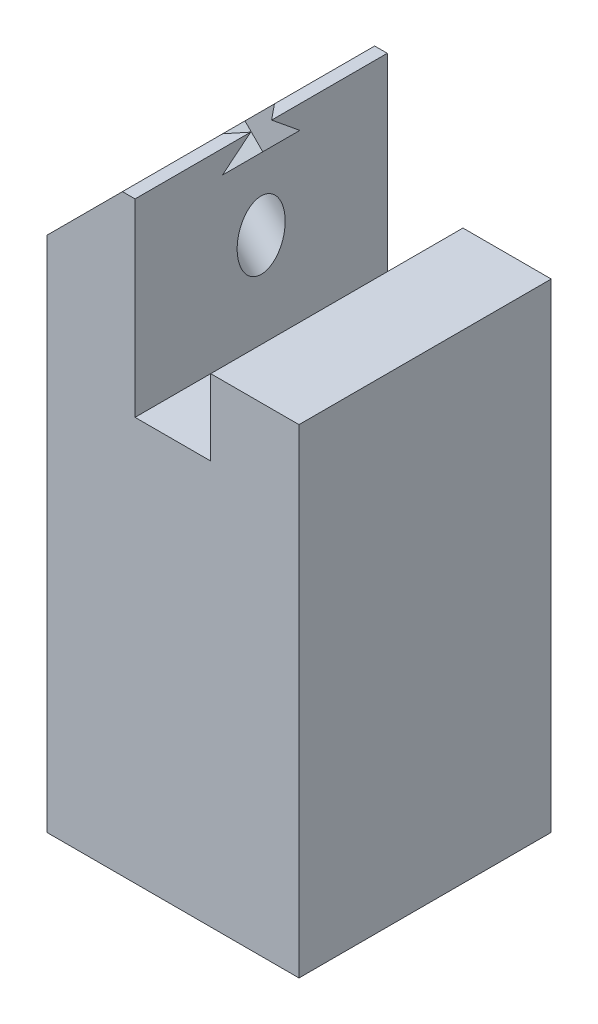
ISO-10303-21;
HEADER;
FILE_DESCRIPTION(('STEP AP214'),'2;1');
FILE_NAME('part.step','',(''),(''),'','','');
FILE_SCHEMA(('AUTOMOTIVE_DESIGN { 1 0 10303 214 1 1 1 1 }'));
ENDSEC;
DATA;
#1=APPLICATION_CONTEXT('core data for automotive mechanical design processes');
#2=APPLICATION_PROTOCOL_DEFINITION('international standard','automotive_design',2000,#1);
#3=PRODUCT_CONTEXT('',#1,'mechanical');
#4=PRODUCT('Part','Part','',(#3));
#5=PRODUCT_RELATED_PRODUCT_CATEGORY('part','',(#4));
#6=PRODUCT_DEFINITION_FORMATION('','',#4);
#7=PRODUCT_DEFINITION_CONTEXT('part definition',#1,'design');
#8=PRODUCT_DEFINITION('design','',#6,#7);
#9=PRODUCT_DEFINITION_SHAPE('','',#8);
#10=(LENGTH_UNIT() NAMED_UNIT(*) SI_UNIT(.MILLI.,.METRE.));
#11=(NAMED_UNIT(*) PLANE_ANGLE_UNIT() SI_UNIT($,.RADIAN.));
#12=(NAMED_UNIT(*) SI_UNIT($,.STERADIAN.) SOLID_ANGLE_UNIT());
#13=UNCERTAINTY_MEASURE_WITH_UNIT(LENGTH_MEASURE(1.E-05),#10,'distance_accuracy_value','');
#14=(GEOMETRIC_REPRESENTATION_CONTEXT(3) GLOBAL_UNCERTAINTY_ASSIGNED_CONTEXT((#13)) GLOBAL_UNIT_ASSIGNED_CONTEXT((#10,
#11,#12)) REPRESENTATION_CONTEXT('',''));
#15=CARTESIAN_POINT('',(0.,0.,0.));
#16=DIRECTION('',(0.,0.,1.));
#17=DIRECTION('',(1.,0.,0.));
#18=AXIS2_PLACEMENT_3D('',#15,#16,#17);
#19=CARTESIAN_POINT('',(0.,21.,0.));
#20=DIRECTION('',(0.,-1.,0.));
#21=DIRECTION('',(0.,0.,-1.));
#22=AXIS2_PLACEMENT_3D('',#19,#20,#21);
#23=PLANE('',#22);
#24=DIRECTION('',(0.,0.,-1.));
#25=VECTOR('',#24,1.);
#26=CARTESIAN_POINT('',(-3.,21.,10.));
#27=LINE('',#26,#25);
#28=CARTESIAN_POINT('',(-3.,21.,10.));
#29=VERTEX_POINT('',#28);
#30=CARTESIAN_POINT('',(-3.,21.,0.828081094438323));
#31=VERTEX_POINT('',#30);
#32=EDGE_CURVE('E338',#29,#31,#27,.T.);
#33=ORIENTED_EDGE('',*,*,#32,.T.);
#34=DIRECTION('',(-0.632455532033677,0.,0.774596669241482));
#35=VECTOR('',#34,1.);
#36=CARTESIAN_POINT('',(-1.39432477059613,21.,-1.13846140789458));
#37=LINE('',#36,#35);
#38=CARTESIAN_POINT('',(-4.00000000000001,21.,2.05282596582991));
#39=VERTEX_POINT('',#38);
#40=EDGE_CURVE('E313',#31,#39,#37,.T.);
#41=ORIENTED_EDGE('',*,*,#40,.T.);
#42=DIRECTION('',(0.,0.,1.));
#43=VECTOR('',#42,1.);
#44=CARTESIAN_POINT('',(-4.00000000000001,21.,0.));
#45=LINE('',#44,#43);
#46=CARTESIAN_POINT('',(-4.00000000000001,21.,10.));
#47=VERTEX_POINT('',#46);
#48=EDGE_CURVE('E384',#39,#47,#45,.T.);
#49=ORIENTED_EDGE('',*,*,#48,.T.);
#50=DIRECTION('',(1.,0.,0.));
#51=VECTOR('',#50,1.);
#52=CARTESIAN_POINT('',(-10.,21.,10.));
#53=LINE('',#52,#51);
#54=EDGE_CURVE('E335',#47,#29,#53,.T.);
#55=ORIENTED_EDGE('',*,*,#54,.T.);
#56=EDGE_LOOP('',(#33,#41,#49,#55));
#57=FACE_BOUND('',#56,.T.);
#58=ADVANCED_FACE('F36',(#57),#23,.F.);
#59=CARTESIAN_POINT('',(-4.00000000000001,21.,0.));
#60=DIRECTION('',(0.707106781186549,-0.707106781186546,0.));
#61=DIRECTION('',(0.,0.,1.));
#62=AXIS2_PLACEMENT_3D('',#59,#60,#61);
#63=PLANE('',#62);
#64=DIRECTION('',(0.353553390593273,0.353553390593275,-0.866025403784438));
#65=VECTOR('',#64,1.);
#66=CARTESIAN_POINT('',(-5.20317876114943,19.7968212388506,5.));
#67=LINE('',#66,#65);
#68=CARTESIAN_POINT('',(-5.20317876114943,19.7968212388506,5.));
#69=VERTEX_POINT('',#68);
#70=EDGE_CURVE('E256',#69,#39,#67,.T.);
#71=ORIENTED_EDGE('',*,*,#70,.F.);
#72=DIRECTION('',(0.707106781186546,0.707106781186549,0.));
#73=VECTOR('',#72,1.);
#74=CARTESIAN_POINT('',(-9.28566166578806,15.7143383342119,5.));
#75=LINE('',#74,#73);
#76=CARTESIAN_POINT('',(-9.28566166578806,15.7143383342119,5.));
#77=VERTEX_POINT('',#76);
#78=EDGE_CURVE('E261',#77,#69,#75,.T.);
#79=ORIENTED_EDGE('',*,*,#78,.F.);
#80=DIRECTION('',(0.353553390593273,0.353553390593274,0.866025403784439));
#81=VECTOR('',#80,1.);
#82=CARTESIAN_POINT('',(-11.3269031181074,13.6730968818926,0.));
#83=LINE('',#82,#81);
#84=CARTESIAN_POINT('',(-10.,15.,3.25023557747101));
#85=VERTEX_POINT('',#84);
#86=EDGE_CURVE('E284',#85,#77,#83,.T.);
#87=ORIENTED_EDGE('',*,*,#86,.F.);
#88=DIRECTION('',(0.,0.,-1.));
#89=VECTOR('',#88,1.);
#90=CARTESIAN_POINT('',(-10.,15.,10.));
#91=LINE('',#90,#89);
#92=CARTESIAN_POINT('',(-10.,15.,10.));
#93=VERTEX_POINT('',#92);
#94=EDGE_CURVE('E45',#93,#85,#91,.T.);
#95=ORIENTED_EDGE('',*,*,#94,.F.);
#96=DIRECTION('',(0.707106781186546,0.707106781186549,0.));
#97=VECTOR('',#96,1.);
#98=CARTESIAN_POINT('',(-4.00000000000001,21.,10.));
#99=LINE('',#98,#97);
#100=EDGE_CURVE('E388',#47,#93,#99,.F.);
#101=ORIENTED_EDGE('',*,*,#100,.F.);
#102=ORIENTED_EDGE('',*,*,#48,.F.);
#103=EDGE_LOOP('',(#71,#79,#87,#95,#101,#102));
#104=FACE_BOUND('',#103,.T.);
#105=ADVANCED_FACE('F401',(#104),#63,.F.);
#106=CARTESIAN_POINT('',(-0.173352401603255,10.6845119746658,0.));
#107=DIRECTION('',(-0.707106781186549,0.707106781186546,0.));
#108=DIRECTION('',(-0.707106781186546,-0.707106781186549,0.));
#109=AXIS2_PLACEMENT_3D('',#106,#107,#108);
#110=CYLINDRICAL_SURFACE('',#109,1.905);
#111=CARTESIAN_POINT('',(-3.,13.5111595730625,0.));
#112=DIRECTION('',(-1.,0.,0.));
#113=DIRECTION('',(0.,1.,0.));
#114=AXIS2_PLACEMENT_3D('',#111,#112,#113);
#115=ELLIPSE('',#114,2.69407683632074,1.905);
#116=CARTESIAN_POINT('',(-3.,16.2052364093833,0.));
#117=VERTEX_POINT('',#116);
#118=EDGE_CURVE('E331',#117,#117,#115,.T.);
#119=ORIENTED_EDGE('',*,*,#118,.F.);
#120=EDGE_LOOP('',(#119));
#121=FACE_BOUND('',#120,.T.);
#122=CARTESIAN_POINT('',(-5.83020665109565,16.3413662241582,0.));
#123=DIRECTION('',(-0.707106781186549,0.707106781186546,0.));
#124=DIRECTION('',(-0.707106781186546,-0.707106781186549,0.));
#125=AXIS2_PLACEMENT_3D('',#122,#123,#124);
#126=CIRCLE('',#125,1.905);
#127=CARTESIAN_POINT('',(-7.17724506925602,14.9943278059978,0.));
#128=VERTEX_POINT('',#127);
#129=EDGE_CURVE('E290',#128,#128,#126,.F.);
#130=ORIENTED_EDGE('',*,*,#129,.F.);
#131=EDGE_LOOP('',(#130));
#132=FACE_BOUND('',#131,.T.);
#133=ADVANCED_FACE('F398',(#121,#132),#110,.F.);
#134=CARTESIAN_POINT('',(0.,6.,0.));
#135=DIRECTION('',(0.,-1.,0.));
#136=DIRECTION('',(0.,0.,-1.));
#137=AXIS2_PLACEMENT_3D('',#134,#135,#136);
#138=PLANE('',#137);
#139=DIRECTION('',(0.,0.,-1.));
#140=VECTOR('',#139,1.);
#141=CARTESIAN_POINT('',(-3.,6.,10.));
#142=LINE('',#141,#140);
#143=CARTESIAN_POINT('',(-3.,6.,10.));
#144=VERTEX_POINT('',#143);
#145=CARTESIAN_POINT('',(-3.,6.,-10.));
#146=VERTEX_POINT('',#145);
#147=EDGE_CURVE('E334',#144,#146,#142,.T.);
#148=ORIENTED_EDGE('',*,*,#147,.F.);
#149=DIRECTION('',(1.,0.,0.));
#150=VECTOR('',#149,1.);
#151=CARTESIAN_POINT('',(-10.,6.,10.));
#152=LINE('',#151,#150);
#153=CARTESIAN_POINT('',(3.,6.,10.));
#154=VERTEX_POINT('',#153);
#155=EDGE_CURVE('E374',#144,#154,#152,.T.);
#156=ORIENTED_EDGE('',*,*,#155,.T.);
#157=DIRECTION('',(0.,0.,1.));
#158=VECTOR('',#157,1.);
#159=CARTESIAN_POINT('',(3.,6.,10.));
#160=LINE('',#159,#158);
#161=CARTESIAN_POINT('',(3.,6.,-10.));
#162=VERTEX_POINT('',#161);
#163=EDGE_CURVE('E352',#162,#154,#160,.T.);
#164=ORIENTED_EDGE('',*,*,#163,.F.);
#165=DIRECTION('',(-1.,0.,0.));
#166=VECTOR('',#165,1.);
#167=CARTESIAN_POINT('',(-10.,6.,-10.));
#168=LINE('',#167,#166);
#169=EDGE_CURVE('E372',#162,#146,#168,.T.);
#170=ORIENTED_EDGE('',*,*,#169,.T.);
#171=EDGE_LOOP('',(#148,#156,#164,#170));
#172=FACE_BOUND('',#171,.T.);
#173=ADVANCED_FACE('F400',(#172),#138,.F.);
#174=CARTESIAN_POINT('',(10.,6.,10.));
#175=DIRECTION('',(-1.,0.,0.));
#176=DIRECTION('',(0.,0.,1.));
#177=AXIS2_PLACEMENT_3D('',#174,#175,#176);
#178=PLANE('',#177);
#179=DIRECTION('',(0.,-1.,0.));
#180=VECTOR('',#179,1.);
#181=CARTESIAN_POINT('',(10.,6.,10.));
#182=LINE('',#181,#180);
#183=CARTESIAN_POINT('',(10.,12.,10.));
#184=VERTEX_POINT('',#183);
#185=CARTESIAN_POINT('',(10.,-26.,10.));
#186=VERTEX_POINT('',#185);
#187=EDGE_CURVE('E376',#184,#186,#182,.T.);
#188=ORIENTED_EDGE('',*,*,#187,.T.);
#189=DIRECTION('',(0.,0.,1.));
#190=VECTOR('',#189,1.);
#191=CARTESIAN_POINT('',(10.,-26.,-10.));
#192=LINE('',#191,#190);
#193=CARTESIAN_POINT('',(10.,-26.,-10.));
#194=VERTEX_POINT('',#193);
#195=EDGE_CURVE('E325',#194,#186,#192,.T.);
#196=ORIENTED_EDGE('',*,*,#195,.F.);
#197=DIRECTION('',(0.,-1.,0.));
#198=VECTOR('',#197,1.);
#199=CARTESIAN_POINT('',(10.,6.,-10.));
#200=LINE('',#199,#198);
#201=CARTESIAN_POINT('',(10.,12.,-10.));
#202=VERTEX_POINT('',#201);
#203=EDGE_CURVE('E382',#202,#194,#200,.T.);
#204=ORIENTED_EDGE('',*,*,#203,.F.);
#205=DIRECTION('',(0.,0.,-1.));
#206=VECTOR('',#205,1.);
#207=CARTESIAN_POINT('',(10.,12.,10.));
#208=LINE('',#207,#206);
#209=EDGE_CURVE('E359',#184,#202,#208,.T.);
#210=ORIENTED_EDGE('',*,*,#209,.F.);
#211=EDGE_LOOP('',(#188,#196,#204,#210));
#212=FACE_BOUND('',#211,.T.);
#213=ADVANCED_FACE('F408',(#212),#178,.F.);
#214=CARTESIAN_POINT('',(-10.,6.,-10.));
#215=DIRECTION('',(0.,0.,1.));
#216=DIRECTION('',(1.,0.,0.));
#217=AXIS2_PLACEMENT_3D('',#214,#215,#216);
#218=PLANE('',#217);
#219=DIRECTION('',(0.,-1.,0.));
#220=VECTOR('',#219,1.);
#221=CARTESIAN_POINT('',(-10.,6.,-10.));
#222=LINE('',#221,#220);
#223=CARTESIAN_POINT('',(-10.,15.,-10.));
#224=VERTEX_POINT('',#223);
#225=CARTESIAN_POINT('',(-10.,-26.,-10.));
#226=VERTEX_POINT('',#225);
#227=EDGE_CURVE('E380',#224,#226,#222,.T.);
#228=ORIENTED_EDGE('',*,*,#227,.F.);
#229=DIRECTION('',(-0.707106781186546,-0.707106781186549,0.));
#230=VECTOR('',#229,1.);
#231=CARTESIAN_POINT('',(-4.00000000000001,21.,-10.));
#232=LINE('',#231,#230);
#233=CARTESIAN_POINT('',(-4.00000000000001,21.,-10.));
#234=VERTEX_POINT('',#233);
#235=EDGE_CURVE('E11',#224,#234,#232,.F.);
#236=ORIENTED_EDGE('',*,*,#235,.T.);
#237=DIRECTION('',(-1.,0.,0.));
#238=VECTOR('',#237,1.);
#239=CARTESIAN_POINT('',(-10.,21.,-10.));
#240=LINE('',#239,#238);
#241=CARTESIAN_POINT('',(-3.,21.,-10.));
#242=VERTEX_POINT('',#241);
#243=EDGE_CURVE('E341',#242,#234,#240,.T.);
#244=ORIENTED_EDGE('',*,*,#243,.F.);
#245=DIRECTION('',(0.,-1.,0.));
#246=VECTOR('',#245,1.);
#247=CARTESIAN_POINT('',(-3.,21.,-10.));
#248=LINE('',#247,#246);
#249=EDGE_CURVE('E344',#242,#146,#248,.T.);
#250=ORIENTED_EDGE('',*,*,#249,.T.);
#251=ORIENTED_EDGE('',*,*,#169,.F.);
#252=DIRECTION('',(0.,-1.,0.));
#253=VECTOR('',#252,1.);
#254=CARTESIAN_POINT('',(3.,12.,-10.));
#255=LINE('',#254,#253);
#256=CARTESIAN_POINT('',(3.,12.,-10.));
#257=VERTEX_POINT('',#256);
#258=EDGE_CURVE('E364',#257,#162,#255,.T.);
#259=ORIENTED_EDGE('',*,*,#258,.F.);
#260=DIRECTION('',(-1.,0.,0.));
#261=VECTOR('',#260,1.);
#262=CARTESIAN_POINT('',(3.,12.,-10.));
#263=LINE('',#262,#261);
#264=EDGE_CURVE('E362',#202,#257,#263,.T.);
#265=ORIENTED_EDGE('',*,*,#264,.F.);
#266=ORIENTED_EDGE('',*,*,#203,.T.);
#267=DIRECTION('',(1.,0.,0.));
#268=VECTOR('',#267,1.);
#269=CARTESIAN_POINT('',(10.,-26.,-10.));
#270=LINE('',#269,#268);
#271=EDGE_CURVE('E322',#226,#194,#270,.T.);
#272=ORIENTED_EDGE('',*,*,#271,.F.);
#273=EDGE_LOOP('',(#228,#236,#244,#250,#251,#259,#265,#266,#272));
#274=FACE_BOUND('',#273,.T.);
#275=ADVANCED_FACE('F453',(#274),#218,.F.);
#276=CARTESIAN_POINT('',(-10.,6.,10.));
#277=DIRECTION('',(1.,0.,0.));
#278=DIRECTION('',(0.,0.,-1.));
#279=AXIS2_PLACEMENT_3D('',#276,#277,#278);
#280=PLANE('',#279);
#281=ORIENTED_EDGE('',*,*,#94,.T.);
#282=DIRECTION('',(0.,-0.632455532033675,-0.774596669241484));
#283=VECTOR('',#282,1.);
#284=CARTESIAN_POINT('',(-10.,14.7066957438375,2.8910126939787));
#285=LINE('',#284,#283);
#286=CARTESIAN_POINT('',(-10.,12.3461937637853,0.));
#287=VERTEX_POINT('',#286);
#288=EDGE_CURVE('E310',#85,#287,#285,.T.);
#289=ORIENTED_EDGE('',*,*,#288,.T.);
#290=DIRECTION('',(0.,0.632455532033675,-0.774596669241484));
#291=VECTOR('',#290,1.);
#292=CARTESIAN_POINT('',(-10.,4.9087367727048,9.10898730602131));
#293=LINE('',#292,#291);
#294=CARTESIAN_POINT('',(-10.,15.,-3.25023557747101));
#295=VERTEX_POINT('',#294);
#296=EDGE_CURVE('E307',#287,#295,#293,.T.);
#297=ORIENTED_EDGE('',*,*,#296,.T.);
#298=EDGE_CURVE('E390',#295,#224,#91,.T.);
#299=ORIENTED_EDGE('',*,*,#298,.T.);
#300=ORIENTED_EDGE('',*,*,#227,.T.);
#301=DIRECTION('',(0.,0.,-1.));
#302=VECTOR('',#301,1.);
#303=CARTESIAN_POINT('',(-10.,-26.,-10.));
#304=LINE('',#303,#302);
#305=CARTESIAN_POINT('',(-10.,-26.,10.));
#306=VERTEX_POINT('',#305);
#307=EDGE_CURVE('E319',#306,#226,#304,.T.);
#308=ORIENTED_EDGE('',*,*,#307,.F.);
#309=DIRECTION('',(0.,-1.,0.));
#310=VECTOR('',#309,1.);
#311=CARTESIAN_POINT('',(-10.,6.,10.));
#312=LINE('',#311,#310);
#313=EDGE_CURVE('E378',#93,#306,#312,.T.);
#314=ORIENTED_EDGE('',*,*,#313,.F.);
#315=EDGE_LOOP('',(#281,#289,#297,#299,#300,#308,#314));
#316=FACE_BOUND('',#315,.T.);
#317=ADVANCED_FACE('F457',(#316),#280,.F.);
#318=CARTESIAN_POINT('',(-10.,6.,10.));
#319=DIRECTION('',(0.,0.,-1.));
#320=DIRECTION('',(-1.,0.,0.));
#321=AXIS2_PLACEMENT_3D('',#318,#319,#320);
#322=PLANE('',#321);
#323=ORIENTED_EDGE('',*,*,#54,.F.);
#324=ORIENTED_EDGE('',*,*,#100,.T.);
#325=ORIENTED_EDGE('',*,*,#313,.T.);
#326=DIRECTION('',(-1.,0.,0.));
#327=VECTOR('',#326,1.);
#328=CARTESIAN_POINT('',(10.,-26.,10.));
#329=LINE('',#328,#327);
#330=EDGE_CURVE('E328',#186,#306,#329,.T.);
#331=ORIENTED_EDGE('',*,*,#330,.F.);
#332=ORIENTED_EDGE('',*,*,#187,.F.);
#333=DIRECTION('',(1.,0.,0.));
#334=VECTOR('',#333,1.);
#335=CARTESIAN_POINT('',(3.,12.,10.));
#336=LINE('',#335,#334);
#337=CARTESIAN_POINT('',(3.,12.,10.));
#338=VERTEX_POINT('',#337);
#339=EDGE_CURVE('E356',#338,#184,#336,.T.);
#340=ORIENTED_EDGE('',*,*,#339,.F.);
#341=DIRECTION('',(0.,-1.,0.));
#342=VECTOR('',#341,1.);
#343=CARTESIAN_POINT('',(3.,12.,10.));
#344=LINE('',#343,#342);
#345=EDGE_CURVE('E369',#338,#154,#344,.T.);
#346=ORIENTED_EDGE('',*,*,#345,.T.);
#347=ORIENTED_EDGE('',*,*,#155,.F.);
#348=DIRECTION('',(0.,-1.,0.));
#349=VECTOR('',#348,1.);
#350=CARTESIAN_POINT('',(-3.,21.,10.));
#351=LINE('',#350,#349);
#352=EDGE_CURVE('E349',#29,#144,#351,.T.);
#353=ORIENTED_EDGE('',*,*,#352,.F.);
#354=EDGE_LOOP('',(#323,#324,#325,#331,#332,#340,#346,#347,#353));
#355=FACE_BOUND('',#354,.T.);
#356=ADVANCED_FACE('F478',(#355),#322,.F.);
#357=CARTESIAN_POINT('',(3.,12.,10.));
#358=DIRECTION('',(1.,0.,0.));
#359=DIRECTION('',(0.,0.,-1.));
#360=AXIS2_PLACEMENT_3D('',#357,#358,#359);
#361=PLANE('',#360);
#362=ORIENTED_EDGE('',*,*,#163,.T.);
#363=ORIENTED_EDGE('',*,*,#345,.F.);
#364=DIRECTION('',(0.,0.,1.));
#365=VECTOR('',#364,1.);
#366=CARTESIAN_POINT('',(3.,12.,10.));
#367=LINE('',#366,#365);
#368=EDGE_CURVE('E353',#257,#338,#367,.T.);
#369=ORIENTED_EDGE('',*,*,#368,.F.);
#370=ORIENTED_EDGE('',*,*,#258,.T.);
#371=EDGE_LOOP('',(#362,#363,#369,#370));
#372=FACE_BOUND('',#371,.T.);
#373=ADVANCED_FACE('F484',(#372),#361,.F.);
#374=CARTESIAN_POINT('',(0.,12.,0.));
#375=DIRECTION('',(0.,-1.,0.));
#376=DIRECTION('',(0.,0.,-1.));
#377=AXIS2_PLACEMENT_3D('',#374,#375,#376);
#378=PLANE('',#377);
#379=ORIENTED_EDGE('',*,*,#368,.T.);
#380=ORIENTED_EDGE('',*,*,#339,.T.);
#381=ORIENTED_EDGE('',*,*,#209,.T.);
#382=ORIENTED_EDGE('',*,*,#264,.T.);
#383=EDGE_LOOP('',(#379,#380,#381,#382));
#384=FACE_BOUND('',#383,.T.);
#385=ADVANCED_FACE('F430',(#384),#378,.F.);
#386=CARTESIAN_POINT('',(-3.,21.,10.));
#387=DIRECTION('',(-1.,0.,0.));
#388=DIRECTION('',(0.,0.,1.));
#389=AXIS2_PLACEMENT_3D('',#386,#387,#388);
#390=PLANE('',#389);
#391=ORIENTED_EDGE('',*,*,#118,.T.);
#392=EDGE_LOOP('',(#391));
#393=FACE_BOUND('',#392,.T.);
#394=DIRECTION('',(0.,0.,-1.));
#395=VECTOR('',#394,1.);
#396=CARTESIAN_POINT('',(-3.,19.1715728752538,10.));
#397=LINE('',#396,#395);
#398=CARTESIAN_POINT('',(-3.,19.1715728752538,3.06743783818447));
#399=VERTEX_POINT('',#398);
#400=CARTESIAN_POINT('',(-3.,19.1715728752538,-3.06743783818447));
#401=VERTEX_POINT('',#400);
#402=EDGE_CURVE('E301',#399,#401,#397,.T.);
#403=ORIENTED_EDGE('',*,*,#402,.F.);
#404=DIRECTION('',(0.,0.632455532033676,-0.774596669241484));
#405=VECTOR('',#404,1.);
#406=CARTESIAN_POINT('',(-3.,16.5066957438375,6.33123243777533));
#407=LINE('',#406,#405);
#408=EDGE_CURVE('E316',#399,#31,#407,.T.);
#409=ORIENTED_EDGE('',*,*,#408,.T.);
#410=ORIENTED_EDGE('',*,*,#32,.F.);
#411=ORIENTED_EDGE('',*,*,#352,.T.);
#412=ORIENTED_EDGE('',*,*,#147,.T.);
#413=ORIENTED_EDGE('',*,*,#249,.F.);
#414=CARTESIAN_POINT('',(-3.,21.,-0.828081094438326));
#415=VERTEX_POINT('',#414);
#416=EDGE_CURVE('E337',#415,#242,#27,.T.);
#417=ORIENTED_EDGE('',*,*,#416,.F.);
#418=DIRECTION('',(0.,-0.632455532033676,-0.774596669241484));
#419=VECTOR('',#418,1.);
#420=CARTESIAN_POINT('',(-3.,26.3046547149702,5.66876756222467));
#421=LINE('',#420,#419);
#422=EDGE_CURVE('E304',#415,#401,#421,.T.);
#423=ORIENTED_EDGE('',*,*,#422,.T.);
#424=EDGE_LOOP('',(#403,#409,#410,#411,#412,#413,#417,#423));
#425=FACE_BOUND('',#424,.T.);
#426=ADVANCED_FACE('F422',(#393,#425),#390,.F.);
#427=CARTESIAN_POINT('',(-4.00000000000001,21.,-2.05282596582992));
#428=VERTEX_POINT('',#427);
#429=EDGE_CURVE('E385',#234,#428,#45,.T.);
#430=ORIENTED_EDGE('',*,*,#429,.T.);
#431=DIRECTION('',(0.632455532033677,0.,0.774596669241482));
#432=VECTOR('',#431,1.);
#433=CARTESIAN_POINT('',(-1.39432477059613,21.,1.13846140789458));
#434=LINE('',#433,#432);
#435=EDGE_CURVE('E61',#428,#415,#434,.T.);
#436=ORIENTED_EDGE('',*,*,#435,.T.);
#437=ORIENTED_EDGE('',*,*,#416,.T.);
#438=ORIENTED_EDGE('',*,*,#243,.T.);
#439=EDGE_LOOP('',(#430,#436,#437,#438));
#440=FACE_BOUND('',#439,.T.);
#441=ADVANCED_FACE('F417',(#440),#23,.F.);
#442=DIRECTION('',(-0.353553390593273,-0.353553390593275,0.866025403784439));
#443=VECTOR('',#442,1.);
#444=CARTESIAN_POINT('',(-9.28566166578806,15.7143383342119,-5.));
#445=LINE('',#444,#443);
#446=CARTESIAN_POINT('',(-9.28566166578806,15.7143383342119,-5.));
#447=VERTEX_POINT('',#446);
#448=EDGE_CURVE('E282',#447,#295,#445,.T.);
#449=ORIENTED_EDGE('',*,*,#448,.F.);
#450=DIRECTION('',(-0.707106781186546,-0.707106781186549,0.));
#451=VECTOR('',#450,1.);
#452=CARTESIAN_POINT('',(-5.20317876114943,19.7968212388506,-5.));
#453=LINE('',#452,#451);
#454=CARTESIAN_POINT('',(-5.20317876114943,19.7968212388506,-5.));
#455=VERTEX_POINT('',#454);
#456=EDGE_CURVE('E279',#455,#447,#453,.T.);
#457=ORIENTED_EDGE('',*,*,#456,.F.);
#458=DIRECTION('',(-0.353553390593273,-0.353553390593275,-0.866025403784438));
#459=VECTOR('',#458,1.);
#460=CARTESIAN_POINT('',(-3.16193730883012,21.8380626911699,0.));
#461=LINE('',#460,#459);
#462=EDGE_CURVE('E277',#428,#455,#461,.T.);
#463=ORIENTED_EDGE('',*,*,#462,.F.);
#464=ORIENTED_EDGE('',*,*,#429,.F.);
#465=ORIENTED_EDGE('',*,*,#235,.F.);
#466=ORIENTED_EDGE('',*,*,#298,.F.);
#467=EDGE_LOOP('',(#449,#457,#463,#464,#465,#466));
#468=FACE_BOUND('',#467,.T.);
#469=ADVANCED_FACE('F38',(#468),#63,.F.);
#470=CARTESIAN_POINT('',(0.,-26.,0.));
#471=DIRECTION('',(0.,-1.,0.));
#472=DIRECTION('',(0.,0.,-1.));
#473=AXIS2_PLACEMENT_3D('',#470,#471,#472);
#474=PLANE('',#473);
#475=DIRECTION('',(-0.867964050699415,0.,-0.496627029765259));
#476=VECTOR('',#475,1.);
#477=CARTESIAN_POINT('',(0.0247073670413129,-26.,6.35080490011677));
#478=LINE('',#477,#476);
#479=CARTESIAN_POINT('',(0.0247073670413129,-26.,6.35080490011677));
#480=VERTEX_POINT('',#479);
#481=CARTESIAN_POINT('',(-5.48760469445916,-26.,3.19679965757679));
#482=VERTEX_POINT('',#481);
#483=EDGE_CURVE('E53',#480,#482,#478,.T.);
#484=ORIENTED_EDGE('',*,*,#483,.F.);
#485=DIRECTION('',(-0.864073649332432,0.,0.503365402594708));
#486=VECTOR('',#485,1.);
#487=CARTESIAN_POINT('',(5.51231206150047,-26.,3.15400524253998));
#488=LINE('',#487,#486);
#489=CARTESIAN_POINT('',(5.51231206150047,-26.,3.15400524253998));
#490=VERTEX_POINT('',#489);
#491=EDGE_CURVE('E220',#490,#480,#488,.T.);
#492=ORIENTED_EDGE('',*,*,#491,.F.);
#493=DIRECTION('',(0.00389040136698241,0.,0.999992432359967));
#494=VECTOR('',#493,1.);
#495=CARTESIAN_POINT('',(5.48760469445916,-26.,-3.19679965757679));
#496=LINE('',#495,#494);
#497=CARTESIAN_POINT('',(5.48760469445916,-26.,-3.19679965757679));
#498=VERTEX_POINT('',#497);
#499=EDGE_CURVE('E223',#498,#490,#496,.T.);
#500=ORIENTED_EDGE('',*,*,#499,.F.);
#501=DIRECTION('',(0.867964050699415,0.,0.496627029765259));
#502=VECTOR('',#501,1.);
#503=CARTESIAN_POINT('',(-0.0247073670413127,-26.,-6.35080490011677));
#504=LINE('',#503,#502);
#505=CARTESIAN_POINT('',(-0.0247073670413127,-26.,-6.35080490011677));
#506=VERTEX_POINT('',#505);
#507=EDGE_CURVE('E239',#506,#498,#504,.T.);
#508=ORIENTED_EDGE('',*,*,#507,.F.);
#509=DIRECTION('',(0.864073649332432,0.,-0.503365402594708));
#510=VECTOR('',#509,1.);
#511=CARTESIAN_POINT('',(-5.51231206150048,-26.,-3.15400524253998));
#512=LINE('',#511,#510);
#513=CARTESIAN_POINT('',(-5.51231206150048,-26.,-3.15400524253998));
#514=VERTEX_POINT('',#513);
#515=EDGE_CURVE('E236',#514,#506,#512,.T.);
#516=ORIENTED_EDGE('',*,*,#515,.F.);
#517=DIRECTION('',(-0.00389040136698241,0.,-0.999992432359967));
#518=VECTOR('',#517,1.);
#519=CARTESIAN_POINT('',(-5.48760469445916,-26.,3.19679965757679));
#520=LINE('',#519,#518);
#521=EDGE_CURVE('E234',#482,#514,#520,.T.);
#522=ORIENTED_EDGE('',*,*,#521,.F.);
#523=EDGE_LOOP('',(#484,#492,#500,#508,#516,#522));
#524=FACE_BOUND('',#523,.T.);
#525=ORIENTED_EDGE('',*,*,#307,.T.);
#526=ORIENTED_EDGE('',*,*,#271,.T.);
#527=ORIENTED_EDGE('',*,*,#195,.T.);
#528=ORIENTED_EDGE('',*,*,#330,.T.);
#529=EDGE_LOOP('',(#525,#526,#527,#528));
#530=FACE_BOUND('',#529,.T.);
#531=ADVANCED_FACE('F428',(#524,#530),#474,.T.);
#532=CARTESIAN_POINT('',(-3.78896519877634,18.3826076764775,5.));
#533=DIRECTION('',(0.612372435695793,0.612372435695796,0.5));
#534=DIRECTION('',(-0.707106781186549,0.707106781186546,0.));
#535=AXIS2_PLACEMENT_3D('',#532,#533,#534);
#536=PLANE('',#535);
#537=DIRECTION('',(0.353553390593273,0.353553390593275,-0.866025403784438));
#538=VECTOR('',#537,1.);
#539=CARTESIAN_POINT('',(-3.78896519877634,18.3826076764775,5.));
#540=LINE('',#539,#538);
#541=CARTESIAN_POINT('',(-3.78896519877634,18.3826076764775,5.));
#542=VERTEX_POINT('',#541);
#543=EDGE_CURVE('E257',#542,#399,#540,.T.);
#544=ORIENTED_EDGE('',*,*,#543,.F.);
#545=DIRECTION('',(-0.707106781186549,0.707106781186546,0.));
#546=VECTOR('',#545,1.);
#547=CARTESIAN_POINT('',(-3.78896519877634,18.3826076764775,5.));
#548=LINE('',#547,#546);
#549=EDGE_CURVE('E288',#542,#69,#548,.T.);
#550=ORIENTED_EDGE('',*,*,#549,.T.);
#551=ORIENTED_EDGE('',*,*,#70,.T.);
#552=ORIENTED_EDGE('',*,*,#40,.F.);
#553=ORIENTED_EDGE('',*,*,#408,.F.);
#554=EDGE_LOOP('',(#544,#550,#551,#552,#553));
#555=FACE_BOUND('',#554,.T.);
#556=ADVANCED_FACE('F471',(#555),#536,.F.);
#557=CARTESIAN_POINT('',(-9.91268955573427,12.2588833195195,0.));
#558=DIRECTION('',(-0.612372435695793,-0.612372435695796,0.5));
#559=DIRECTION('',(0.707106781186549,-0.707106781186546,0.));
#560=AXIS2_PLACEMENT_3D('',#557,#558,#559);
#561=PLANE('',#560);
#562=ORIENTED_EDGE('',*,*,#86,.T.);
#563=DIRECTION('',(-0.707106781186549,0.707106781186546,0.));
#564=VECTOR('',#563,1.);
#565=CARTESIAN_POINT('',(-7.87144810341496,14.3001247718388,5.));
#566=LINE('',#565,#564);
#567=CARTESIAN_POINT('',(-7.87144810341496,14.3001247718388,5.));
#568=VERTEX_POINT('',#567);
#569=EDGE_CURVE('E291',#568,#77,#566,.T.);
#570=ORIENTED_EDGE('',*,*,#569,.F.);
#571=DIRECTION('',(0.353553390593273,0.353553390593274,0.866025403784439));
#572=VECTOR('',#571,1.);
#573=CARTESIAN_POINT('',(-9.91268955573427,12.2588833195195,0.));
#574=LINE('',#573,#572);
#575=CARTESIAN_POINT('',(-9.91268955573427,12.2588833195195,0.));
#576=VERTEX_POINT('',#575);
#577=EDGE_CURVE('E269',#576,#568,#574,.T.);
#578=ORIENTED_EDGE('',*,*,#577,.F.);
#579=DIRECTION('',(-0.707106781186549,0.707106781186546,0.));
#580=VECTOR('',#579,1.);
#581=CARTESIAN_POINT('',(-9.91268955573427,12.2588833195195,0.));
#582=LINE('',#581,#580);
#583=EDGE_CURVE('E294',#576,#287,#582,.T.);
#584=ORIENTED_EDGE('',*,*,#583,.T.);
#585=ORIENTED_EDGE('',*,*,#288,.F.);
#586=EDGE_LOOP('',(#562,#570,#578,#584,#585));
#587=FACE_BOUND('',#586,.T.);
#588=ADVANCED_FACE('F463',(#587),#561,.F.);
#589=CARTESIAN_POINT('',(-7.87144810341496,14.3001247718388,-5.));
#590=DIRECTION('',(-0.612372435695793,-0.612372435695796,-0.5));
#591=DIRECTION('',(0.707106781186549,-0.707106781186546,0.));
#592=AXIS2_PLACEMENT_3D('',#589,#590,#591);
#593=PLANE('',#592);
#594=ORIENTED_EDGE('',*,*,#583,.F.);
#595=DIRECTION('',(-0.353553390593273,-0.353553390593275,0.866025403784439));
#596=VECTOR('',#595,1.);
#597=CARTESIAN_POINT('',(-7.87144810341496,14.3001247718388,-5.));
#598=LINE('',#597,#596);
#599=CARTESIAN_POINT('',(-7.87144810341496,14.3001247718388,-5.));
#600=VERTEX_POINT('',#599);
#601=EDGE_CURVE('E266',#600,#576,#598,.T.);
#602=ORIENTED_EDGE('',*,*,#601,.F.);
#603=DIRECTION('',(-0.707106781186549,0.707106781186546,0.));
#604=VECTOR('',#603,1.);
#605=CARTESIAN_POINT('',(-7.87144810341496,14.3001247718388,-5.));
#606=LINE('',#605,#604);
#607=EDGE_CURVE('E297',#600,#447,#606,.T.);
#608=ORIENTED_EDGE('',*,*,#607,.T.);
#609=ORIENTED_EDGE('',*,*,#448,.T.);
#610=ORIENTED_EDGE('',*,*,#296,.F.);
#611=EDGE_LOOP('',(#594,#602,#608,#609,#610));
#612=FACE_BOUND('',#611,.T.);
#613=ADVANCED_FACE('F460',(#612),#593,.F.);
#614=CARTESIAN_POINT('',(-1.74772374645702,20.4238491287968,0.));
#615=DIRECTION('',(0.612372435695793,0.612372435695796,-0.500000000000001));
#616=DIRECTION('',(-0.707106781186549,0.707106781186546,0.));
#617=AXIS2_PLACEMENT_3D('',#614,#615,#616);
#618=PLANE('',#617);
#619=ORIENTED_EDGE('',*,*,#435,.F.);
#620=ORIENTED_EDGE('',*,*,#462,.T.);
#621=DIRECTION('',(-0.707106781186549,0.707106781186546,0.));
#622=VECTOR('',#621,1.);
#623=CARTESIAN_POINT('',(-3.78896519877634,18.3826076764775,-5.));
#624=LINE('',#623,#622);
#625=CARTESIAN_POINT('',(-3.78896519877634,18.3826076764775,-5.));
#626=VERTEX_POINT('',#625);
#627=EDGE_CURVE('E275',#626,#455,#624,.T.);
#628=ORIENTED_EDGE('',*,*,#627,.F.);
#629=DIRECTION('',(-0.353553390593273,-0.353553390593275,-0.866025403784438));
#630=VECTOR('',#629,1.);
#631=CARTESIAN_POINT('',(-1.74772374645702,20.4238491287968,0.));
#632=LINE('',#631,#630);
#633=EDGE_CURVE('E260',#401,#626,#632,.T.);
#634=ORIENTED_EDGE('',*,*,#633,.F.);
#635=ORIENTED_EDGE('',*,*,#422,.F.);
#636=EDGE_LOOP('',(#619,#620,#628,#634,#635));
#637=FACE_BOUND('',#636,.T.);
#638=ADVANCED_FACE('F440',(#637),#618,.F.);
#639=CARTESIAN_POINT('',(-11.0857864376269,11.0857864376269,0.));
#640=DIRECTION('',(-0.707106781186549,0.707106781186546,0.));
#641=DIRECTION('',(-0.707106781186546,-0.707106781186549,0.));
#642=AXIS2_PLACEMENT_3D('',#639,#640,#641);
#643=PLANE('',#642);
#644=ORIENTED_EDGE('',*,*,#129,.T.);
#645=EDGE_LOOP('',(#644));
#646=FACE_BOUND('',#645,.T.);
#647=ORIENTED_EDGE('',*,*,#402,.T.);
#648=ORIENTED_EDGE('',*,*,#633,.T.);
#649=DIRECTION('',(-0.707106781186546,-0.707106781186549,0.));
#650=VECTOR('',#649,1.);
#651=CARTESIAN_POINT('',(-3.78896519877634,18.3826076764775,-5.));
#652=LINE('',#651,#650);
#653=EDGE_CURVE('E263',#626,#600,#652,.T.);
#654=ORIENTED_EDGE('',*,*,#653,.T.);
#655=ORIENTED_EDGE('',*,*,#601,.T.);
#656=ORIENTED_EDGE('',*,*,#577,.T.);
#657=DIRECTION('',(0.707106781186546,0.707106781186549,0.));
#658=VECTOR('',#657,1.);
#659=CARTESIAN_POINT('',(-7.87144810341496,14.3001247718388,5.));
#660=LINE('',#659,#658);
#661=EDGE_CURVE('E272',#568,#542,#660,.T.);
#662=ORIENTED_EDGE('',*,*,#661,.T.);
#663=ORIENTED_EDGE('',*,*,#543,.T.);
#664=EDGE_LOOP('',(#647,#648,#654,#655,#656,#662,#663));
#665=FACE_BOUND('',#664,.T.);
#666=ADVANCED_FACE('F395',(#646,#665),#643,.T.);
#667=CARTESIAN_POINT('',(-7.87144810341496,14.3001247718388,5.));
#668=DIRECTION('',(0.,0.,1.));
#669=DIRECTION('',(1.,0.,0.));
#670=AXIS2_PLACEMENT_3D('',#667,#668,#669);
#671=PLANE('',#670);
#672=ORIENTED_EDGE('',*,*,#78,.T.);
#673=ORIENTED_EDGE('',*,*,#549,.F.);
#674=ORIENTED_EDGE('',*,*,#661,.F.);
#675=ORIENTED_EDGE('',*,*,#569,.T.);
#676=EDGE_LOOP('',(#672,#673,#674,#675));
#677=FACE_BOUND('',#676,.T.);
#678=ADVANCED_FACE('F466',(#677),#671,.F.);
#679=CARTESIAN_POINT('',(-3.78896519877634,18.3826076764775,-5.));
#680=DIRECTION('',(0.,0.,-1.));
#681=DIRECTION('',(0.,1.,0.));
#682=AXIS2_PLACEMENT_3D('',#679,#680,#681);
#683=PLANE('',#682);
#684=ORIENTED_EDGE('',*,*,#456,.T.);
#685=ORIENTED_EDGE('',*,*,#607,.F.);
#686=ORIENTED_EDGE('',*,*,#653,.F.);
#687=ORIENTED_EDGE('',*,*,#627,.T.);
#688=EDGE_LOOP('',(#684,#685,#686,#687));
#689=FACE_BOUND('',#688,.T.);
#690=ADVANCED_FACE('F444',(#689),#683,.F.);
#691=CARTESIAN_POINT('',(0.,-20.,0.));
#692=DIRECTION('',(0.,-1.,0.));
#693=DIRECTION('',(0.,0.,-1.));
#694=AXIS2_PLACEMENT_3D('',#691,#692,#693);
#695=PLANE('',#694);
#696=DIRECTION('',(-0.867964050699415,0.,-0.496627029765259));
#697=VECTOR('',#696,1.);
#698=CARTESIAN_POINT('',(0.0247073670413129,-20.,6.35080490011677));
#699=LINE('',#698,#697);
#700=CARTESIAN_POINT('',(0.0247073670413129,-20.,6.35080490011677));
#701=VERTEX_POINT('',#700);
#702=CARTESIAN_POINT('',(-5.48760469445916,-20.,3.19679965757679));
#703=VERTEX_POINT('',#702);
#704=EDGE_CURVE('E200',#701,#703,#699,.T.);
#705=ORIENTED_EDGE('',*,*,#704,.T.);
#706=DIRECTION('',(-0.00389040136698241,0.,-0.999992432359967));
#707=VECTOR('',#706,1.);
#708=CARTESIAN_POINT('',(-5.48760469445916,-20.,3.19679965757679));
#709=LINE('',#708,#707);
#710=CARTESIAN_POINT('',(-5.51231206150048,-20.,-3.15400524253998));
#711=VERTEX_POINT('',#710);
#712=EDGE_CURVE('E209',#703,#711,#709,.T.);
#713=ORIENTED_EDGE('',*,*,#712,.T.);
#714=DIRECTION('',(0.864073649332432,0.,-0.503365402594708));
#715=VECTOR('',#714,1.);
#716=CARTESIAN_POINT('',(-5.51231206150048,-20.,-3.15400524253998));
#717=LINE('',#716,#715);
#718=CARTESIAN_POINT('',(-0.0247073670413127,-20.,-6.35080490011677));
#719=VERTEX_POINT('',#718);
#720=EDGE_CURVE('E214',#711,#719,#717,.T.);
#721=ORIENTED_EDGE('',*,*,#720,.T.);
#722=DIRECTION('',(0.867964050699415,0.,0.496627029765259));
#723=VECTOR('',#722,1.);
#724=CARTESIAN_POINT('',(-0.0247073670413127,-20.,-6.35080490011677));
#725=LINE('',#724,#723);
#726=CARTESIAN_POINT('',(5.48760469445916,-20.,-3.19679965757679));
#727=VERTEX_POINT('',#726);
#728=EDGE_CURVE('E227',#719,#727,#725,.T.);
#729=ORIENTED_EDGE('',*,*,#728,.T.);
#730=DIRECTION('',(0.00389040136698241,0.,0.999992432359967));
#731=VECTOR('',#730,1.);
#732=CARTESIAN_POINT('',(5.48760469445916,-20.,-3.19679965757679));
#733=LINE('',#732,#731);
#734=CARTESIAN_POINT('',(5.51231206150047,-20.,3.15400524253998));
#735=VERTEX_POINT('',#734);
#736=EDGE_CURVE('E230',#727,#735,#733,.T.);
#737=ORIENTED_EDGE('',*,*,#736,.T.);
#738=DIRECTION('',(-0.864073649332432,0.,0.503365402594708));
#739=VECTOR('',#738,1.);
#740=CARTESIAN_POINT('',(5.51231206150047,-20.,3.15400524253998));
#741=LINE('',#740,#739);
#742=EDGE_CURVE('E206',#735,#701,#741,.T.);
#743=ORIENTED_EDGE('',*,*,#742,.T.);
#744=EDGE_LOOP('',(#705,#713,#721,#729,#737,#743));
#745=FACE_BOUND('',#744,.T.);
#746=CARTESIAN_POINT('',(0.,-20.,0.));
#747=DIRECTION('',(0.,-1.,0.));
#748=DIRECTION('',(0.,0.,-1.));
#749=AXIS2_PLACEMENT_3D('',#746,#747,#748);
#750=CIRCLE('',#749,2.75);
#751=CARTESIAN_POINT('',(0.,-20.,-2.75));
#752=VERTEX_POINT('',#751);
#753=EDGE_CURVE('E40',#752,#752,#750,.F.);
#754=ORIENTED_EDGE('',*,*,#753,.T.);
#755=EDGE_LOOP('',(#754));
#756=FACE_BOUND('',#755,.T.);
#757=ADVANCED_FACE('F216',(#745,#756),#695,.T.);
#758=CARTESIAN_POINT('',(0.0247073670413129,-20.,6.35080490011677));
#759=DIRECTION('',(-0.496627029765259,0.,0.867964050699415));
#760=DIRECTION('',(0.867964050699415,0.,0.496627029765259));
#761=AXIS2_PLACEMENT_3D('',#758,#759,#760);
#762=PLANE('',#761);
#763=ORIENTED_EDGE('',*,*,#483,.T.);
#764=DIRECTION('',(0.,-1.,0.));
#765=VECTOR('',#764,1.);
#766=CARTESIAN_POINT('',(-5.48760469445916,-20.,3.19679965757679));
#767=LINE('',#766,#765);
#768=EDGE_CURVE('E196',#703,#482,#767,.T.);
#769=ORIENTED_EDGE('',*,*,#768,.F.);
#770=ORIENTED_EDGE('',*,*,#704,.F.);
#771=DIRECTION('',(0.,-1.,0.));
#772=VECTOR('',#771,1.);
#773=CARTESIAN_POINT('',(0.0247073670413129,-20.,6.35080490011677));
#774=LINE('',#773,#772);
#775=EDGE_CURVE('E244',#701,#480,#774,.T.);
#776=ORIENTED_EDGE('',*,*,#775,.T.);
#777=EDGE_LOOP('',(#763,#769,#770,#776));
#778=FACE_BOUND('',#777,.T.);
#779=ADVANCED_FACE('F198',(#778),#762,.F.);
#780=CARTESIAN_POINT('',(5.51231206150047,-20.,3.15400524253998));
#781=DIRECTION('',(0.503365402594708,0.,0.864073649332432));
#782=DIRECTION('',(0.864073649332433,0.,-0.503365402594708));
#783=AXIS2_PLACEMENT_3D('',#780,#781,#782);
#784=PLANE('',#783);
#785=ORIENTED_EDGE('',*,*,#491,.T.);
#786=ORIENTED_EDGE('',*,*,#775,.F.);
#787=ORIENTED_EDGE('',*,*,#742,.F.);
#788=DIRECTION('',(0.,-1.,0.));
#789=VECTOR('',#788,1.);
#790=CARTESIAN_POINT('',(5.51231206150047,-20.,3.15400524253998));
#791=LINE('',#790,#789);
#792=EDGE_CURVE('E246',#735,#490,#791,.T.);
#793=ORIENTED_EDGE('',*,*,#792,.T.);
#794=EDGE_LOOP('',(#785,#786,#787,#793));
#795=FACE_BOUND('',#794,.T.);
#796=ADVANCED_FACE('F628',(#795),#784,.F.);
#797=CARTESIAN_POINT('',(5.48760469445916,-20.,-3.19679965757679));
#798=DIRECTION('',(0.999992432359967,0.,-0.00389040136698241));
#799=DIRECTION('',(-0.00389040136698241,0.,-0.999992432359967));
#800=AXIS2_PLACEMENT_3D('',#797,#798,#799);
#801=PLANE('',#800);
#802=ORIENTED_EDGE('',*,*,#499,.T.);
#803=ORIENTED_EDGE('',*,*,#792,.F.);
#804=ORIENTED_EDGE('',*,*,#736,.F.);
#805=DIRECTION('',(0.,-1.,0.));
#806=VECTOR('',#805,1.);
#807=CARTESIAN_POINT('',(5.48760469445916,-20.,-3.19679965757679));
#808=LINE('',#807,#806);
#809=EDGE_CURVE('E248',#727,#498,#808,.T.);
#810=ORIENTED_EDGE('',*,*,#809,.T.);
#811=EDGE_LOOP('',(#802,#803,#804,#810));
#812=FACE_BOUND('',#811,.T.);
#813=ADVANCED_FACE('F637',(#812),#801,.F.);
#814=CARTESIAN_POINT('',(-0.0247073670413127,-20.,-6.35080490011677));
#815=DIRECTION('',(0.496627029765259,0.,-0.867964050699415));
#816=DIRECTION('',(-0.867964050699415,0.,-0.496627029765259));
#817=AXIS2_PLACEMENT_3D('',#814,#815,#816);
#818=PLANE('',#817);
#819=ORIENTED_EDGE('',*,*,#507,.T.);
#820=ORIENTED_EDGE('',*,*,#809,.F.);
#821=ORIENTED_EDGE('',*,*,#728,.F.);
#822=DIRECTION('',(0.,-1.,0.));
#823=VECTOR('',#822,1.);
#824=CARTESIAN_POINT('',(-0.0247073670413127,-20.,-6.35080490011677));
#825=LINE('',#824,#823);
#826=EDGE_CURVE('E250',#719,#506,#825,.T.);
#827=ORIENTED_EDGE('',*,*,#826,.T.);
#828=EDGE_LOOP('',(#819,#820,#821,#827));
#829=FACE_BOUND('',#828,.T.);
#830=ADVANCED_FACE('F647',(#829),#818,.F.);
#831=CARTESIAN_POINT('',(-5.51231206150048,-20.,-3.15400524253998));
#832=DIRECTION('',(-0.503365402594708,0.,-0.864073649332432));
#833=DIRECTION('',(-0.864073649332432,0.,0.503365402594708));
#834=AXIS2_PLACEMENT_3D('',#831,#832,#833);
#835=PLANE('',#834);
#836=ORIENTED_EDGE('',*,*,#515,.T.);
#837=ORIENTED_EDGE('',*,*,#826,.F.);
#838=ORIENTED_EDGE('',*,*,#720,.F.);
#839=DIRECTION('',(0.,-1.,0.));
#840=VECTOR('',#839,1.);
#841=CARTESIAN_POINT('',(-5.51231206150048,-20.,-3.15400524253998));
#842=LINE('',#841,#840);
#843=EDGE_CURVE('E205',#711,#514,#842,.T.);
#844=ORIENTED_EDGE('',*,*,#843,.T.);
#845=EDGE_LOOP('',(#836,#837,#838,#844));
#846=FACE_BOUND('',#845,.T.);
#847=ADVANCED_FACE('F657',(#846),#835,.F.);
#848=CARTESIAN_POINT('',(-5.48760469445916,-20.,3.19679965757679));
#849=DIRECTION('',(-0.999992432359967,0.,0.00389040136698241));
#850=DIRECTION('',(0.00389040136698241,0.,0.999992432359967));
#851=AXIS2_PLACEMENT_3D('',#848,#849,#850);
#852=PLANE('',#851);
#853=ORIENTED_EDGE('',*,*,#521,.T.);
#854=ORIENTED_EDGE('',*,*,#843,.F.);
#855=ORIENTED_EDGE('',*,*,#712,.F.);
#856=ORIENTED_EDGE('',*,*,#768,.T.);
#857=EDGE_LOOP('',(#853,#854,#855,#856));
#858=FACE_BOUND('',#857,.T.);
#859=ADVANCED_FACE('F210',(#858),#852,.F.);
#860=CARTESIAN_POINT('',(0.,-6.,0.));
#861=DIRECTION('',(0.,-1.,0.));
#862=DIRECTION('',(0.,0.,-1.));
#863=AXIS2_PLACEMENT_3D('',#860,#861,#862);
#864=PLANE('',#863);
#865=CARTESIAN_POINT('',(0.,-6.,0.));
#866=DIRECTION('',(0.,-1.,0.));
#867=DIRECTION('',(0.,0.,-1.));
#868=AXIS2_PLACEMENT_3D('',#865,#866,#867);
#869=CIRCLE('',#868,2.75);
#870=CARTESIAN_POINT('',(0.,-6.,-2.75));
#871=VERTEX_POINT('',#870);
#872=EDGE_CURVE('E253',#871,#871,#869,.T.);
#873=ORIENTED_EDGE('',*,*,#872,.T.);
#874=EDGE_LOOP('',(#873));
#875=FACE_BOUND('',#874,.T.);
#876=ADVANCED_FACE('F595',(#875),#864,.T.);
#877=CARTESIAN_POINT('',(0.,-6.,0.));
#878=DIRECTION('',(0.,-1.,0.));
#879=DIRECTION('',(0.,0.,-1.));
#880=AXIS2_PLACEMENT_3D('',#877,#878,#879);
#881=CYLINDRICAL_SURFACE('',#880,2.75);
#882=ORIENTED_EDGE('',*,*,#872,.F.);
#883=EDGE_LOOP('',(#882));
#884=FACE_BOUND('',#883,.T.);
#885=ORIENTED_EDGE('',*,*,#753,.F.);
#886=EDGE_LOOP('',(#885));
#887=FACE_BOUND('',#886,.T.);
#888=ADVANCED_FACE('F599',(#884,#887),#881,.F.);
#889=CLOSED_SHELL('',(#58,#105,#133,#173,#213,#275,#317,#356,#373,#385,#426,#441,#469,#531,#556,
#588,#613,#638,#666,#678,#690,#757,#779,#796,#813,#830,#847,#859,#876,#888));
#890=MANIFOLD_SOLID_BREP('B2',#889);
#891=ADVANCED_BREP_SHAPE_REPRESENTATION('',(#18,#890),#14);
#892=SHAPE_DEFINITION_REPRESENTATION(#9,#891);
ENDSEC;
END-ISO-10303-21;
